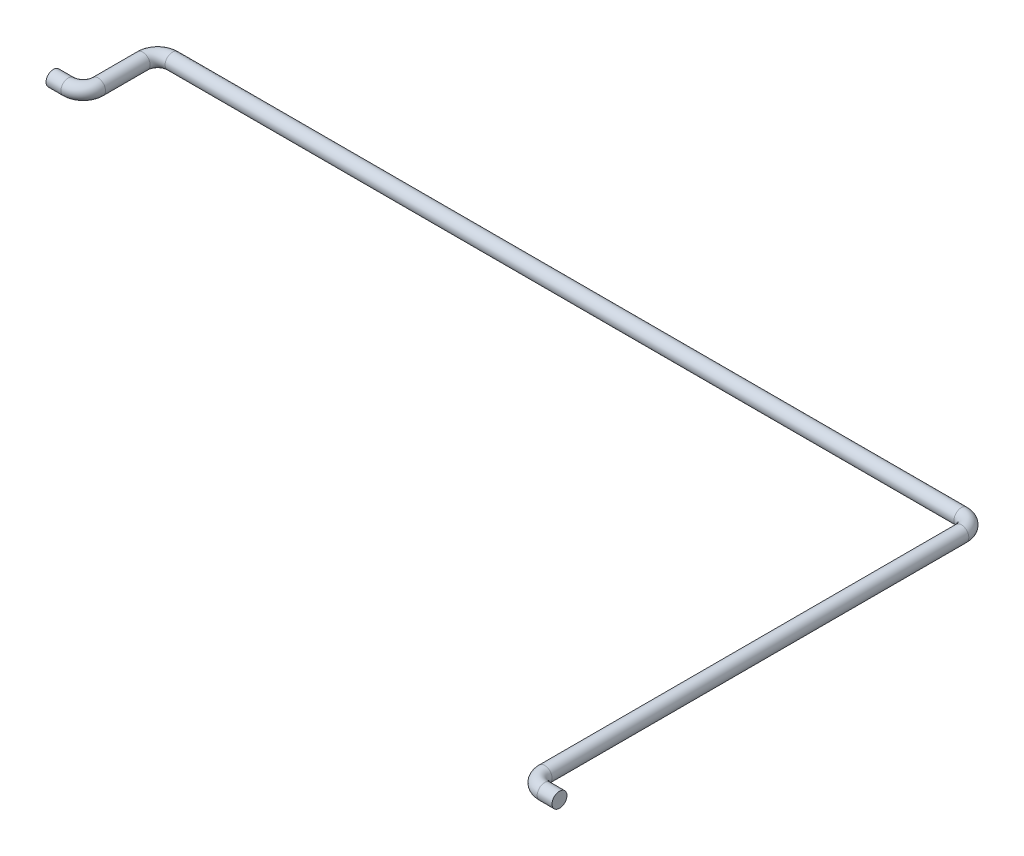
ISO-10303-21;
HEADER;
FILE_DESCRIPTION(('STEP AP214'),'2;1');
FILE_NAME('part.step','',(''),(''),'','','');
FILE_SCHEMA(('AUTOMOTIVE_DESIGN { 1 0 10303 214 1 1 1 1 }'));
ENDSEC;
DATA;
#1=APPLICATION_CONTEXT('core data for automotive mechanical design processes');
#2=APPLICATION_PROTOCOL_DEFINITION('international standard','automotive_design',2000,#1);
#3=PRODUCT_CONTEXT('',#1,'mechanical');
#4=PRODUCT('Part','Part','',(#3));
#5=PRODUCT_RELATED_PRODUCT_CATEGORY('part','',(#4));
#6=PRODUCT_DEFINITION_FORMATION('','',#4);
#7=PRODUCT_DEFINITION_CONTEXT('part definition',#1,'design');
#8=PRODUCT_DEFINITION('design','',#6,#7);
#9=PRODUCT_DEFINITION_SHAPE('','',#8);
#10=(LENGTH_UNIT() NAMED_UNIT(*) SI_UNIT(.MILLI.,.METRE.));
#11=(NAMED_UNIT(*) PLANE_ANGLE_UNIT() SI_UNIT($,.RADIAN.));
#12=(NAMED_UNIT(*) SI_UNIT($,.STERADIAN.) SOLID_ANGLE_UNIT());
#13=UNCERTAINTY_MEASURE_WITH_UNIT(LENGTH_MEASURE(1.E-05),#10,'distance_accuracy_value','');
#14=(GEOMETRIC_REPRESENTATION_CONTEXT(3) GLOBAL_UNCERTAINTY_ASSIGNED_CONTEXT((#13)) GLOBAL_UNIT_ASSIGNED_CONTEXT((#10,
#11,#12)) REPRESENTATION_CONTEXT('',''));
#15=CARTESIAN_POINT('',(0.,0.,0.));
#16=DIRECTION('',(0.,0.,1.));
#17=DIRECTION('',(1.,0.,0.));
#18=AXIS2_PLACEMENT_3D('',#15,#16,#17);
#19=CARTESIAN_POINT('',(58.,0.,25.));
#20=DIRECTION('',(1.,0.,0.));
#21=DIRECTION('',(0.,0.,-1.));
#22=AXIS2_PLACEMENT_3D('',#19,#20,#21);
#23=CYLINDRICAL_SURFACE('',#22,0.5);
#24=CARTESIAN_POINT('',(58.,0.,25.));
#25=DIRECTION('',(1.,0.,0.));
#26=DIRECTION('',(0.,0.,-1.));
#27=AXIS2_PLACEMENT_3D('',#24,#25,#26);
#28=CIRCLE('',#27,0.5);
#29=CARTESIAN_POINT('',(58.,0.,25.5));
#30=VERTEX_POINT('',#29);
#31=EDGE_CURVE('E37',#30,#30,#28,.T.);
#32=ORIENTED_EDGE('',*,*,#31,.T.);
#33=EDGE_LOOP('',(#32));
#34=FACE_BOUND('',#33,.T.);
#35=CARTESIAN_POINT('',(59.,0.,25.));
#36=DIRECTION('',(1.,0.,0.));
#37=DIRECTION('',(0.,0.,-1.));
#38=AXIS2_PLACEMENT_3D('',#35,#36,#37);
#39=CIRCLE('',#38,0.5);
#40=CARTESIAN_POINT('',(59.,0.,24.5));
#41=VERTEX_POINT('',#40);
#42=EDGE_CURVE('E10',#41,#41,#39,.T.);
#43=ORIENTED_EDGE('',*,*,#42,.F.);
#44=EDGE_LOOP('',(#43));
#45=FACE_BOUND('',#44,.T.);
#46=ADVANCED_FACE('F31',(#34,#45),#23,.T.);
#47=CARTESIAN_POINT('',(58.,0.,24.));
#48=DIRECTION('',(0.,1.,0.));
#49=DIRECTION('',(0.,0.,1.));
#50=AXIS2_PLACEMENT_3D('',#47,#48,#49);
#51=TOROIDAL_SURFACE('',#50,1.00000000000001,0.5);
#52=CARTESIAN_POINT('',(57.,0.,24.));
#53=DIRECTION('',(0.,0.,1.));
#54=DIRECTION('',(1.,0.,0.));
#55=AXIS2_PLACEMENT_3D('',#52,#53,#54);
#56=CIRCLE('',#55,0.5);
#57=CARTESIAN_POINT('',(56.5,0.,24.));
#58=VERTEX_POINT('',#57);
#59=EDGE_CURVE('E41',#58,#58,#56,.T.);
#60=CARTESIAN_POINT('',(58.,0.,24.));
#61=DIRECTION('',(0.,1.,0.));
#62=DIRECTION('',(0.,0.,1.));
#63=AXIS2_PLACEMENT_3D('',#60,#61,#62);
#64=CIRCLE('',#63,1.50000000000001);
#65=EDGE_CURVE('',#58,#30,#64,.T.);
#66=ORIENTED_EDGE('',*,*,#59,.T.);
#67=ORIENTED_EDGE('',*,*,#31,.F.);
#68=ORIENTED_EDGE('',*,*,#65,.T.);
#69=ORIENTED_EDGE('',*,*,#65,.F.);
#70=EDGE_LOOP('',(#66,#68,#67,#69));
#71=FACE_BOUND('',#70,.T.);
#72=ADVANCED_FACE('F87',(#71),#51,.T.);
#73=CARTESIAN_POINT('',(57.,0.,-4.));
#74=DIRECTION('',(0.,0.,1.));
#75=DIRECTION('',(1.,0.,0.));
#76=AXIS2_PLACEMENT_3D('',#73,#74,#75);
#77=CYLINDRICAL_SURFACE('',#76,0.5);
#78=CARTESIAN_POINT('',(57.,0.,-4.));
#79=DIRECTION('',(0.,0.,1.));
#80=DIRECTION('',(1.,0.,0.));
#81=AXIS2_PLACEMENT_3D('',#78,#79,#80);
#82=CIRCLE('',#81,0.5);
#83=CARTESIAN_POINT('',(57.5,0.,-3.99999999999999));
#84=VERTEX_POINT('',#83);
#85=EDGE_CURVE('E45',#84,#84,#82,.T.);
#86=ORIENTED_EDGE('',*,*,#85,.T.);
#87=EDGE_LOOP('',(#86));
#88=FACE_BOUND('',#87,.T.);
#89=ORIENTED_EDGE('',*,*,#59,.F.);
#90=EDGE_LOOP('',(#89));
#91=FACE_BOUND('',#90,.T.);
#92=ADVANCED_FACE('F91',(#88,#91),#77,.T.);
#93=CARTESIAN_POINT('',(56.,0.,-4.));
#94=DIRECTION('',(0.,-1.,0.));
#95=DIRECTION('',(0.,0.,-1.));
#96=AXIS2_PLACEMENT_3D('',#93,#94,#95);
#97=TOROIDAL_SURFACE('',#96,1.,0.5);
#98=CARTESIAN_POINT('',(56.,0.,-5.));
#99=DIRECTION('',(1.,0.,0.));
#100=DIRECTION('',(0.,0.,-1.));
#101=AXIS2_PLACEMENT_3D('',#98,#99,#100);
#102=CIRCLE('',#101,0.5);
#103=CARTESIAN_POINT('',(56.,0.,-5.5));
#104=VERTEX_POINT('',#103);
#105=EDGE_CURVE('E50',#104,#104,#102,.T.);
#106=CARTESIAN_POINT('',(56.,0.,-4.));
#107=DIRECTION('',(0.,-1.,0.));
#108=DIRECTION('',(0.,0.,-1.));
#109=AXIS2_PLACEMENT_3D('',#106,#107,#108);
#110=CIRCLE('',#109,1.5);
#111=EDGE_CURVE('',#104,#84,#110,.T.);
#112=ORIENTED_EDGE('',*,*,#105,.T.);
#113=ORIENTED_EDGE('',*,*,#85,.F.);
#114=ORIENTED_EDGE('',*,*,#111,.T.);
#115=ORIENTED_EDGE('',*,*,#111,.F.);
#116=EDGE_LOOP('',(#112,#114,#113,#115));
#117=FACE_BOUND('',#116,.T.);
#118=ADVANCED_FACE('F97',(#117),#97,.T.);
#119=CARTESIAN_POINT('',(3.,0.,-5.));
#120=DIRECTION('',(1.,0.,0.));
#121=DIRECTION('',(0.,0.,-1.));
#122=AXIS2_PLACEMENT_3D('',#119,#120,#121);
#123=CYLINDRICAL_SURFACE('',#122,0.5);
#124=CARTESIAN_POINT('',(3.,0.,-5.));
#125=DIRECTION('',(1.,0.,0.));
#126=DIRECTION('',(0.,0.,-1.));
#127=AXIS2_PLACEMENT_3D('',#124,#125,#126);
#128=CIRCLE('',#127,0.5);
#129=CARTESIAN_POINT('',(3.,0.,-5.5));
#130=VERTEX_POINT('',#129);
#131=EDGE_CURVE('E53',#130,#130,#128,.T.);
#132=ORIENTED_EDGE('',*,*,#131,.T.);
#133=EDGE_LOOP('',(#132));
#134=FACE_BOUND('',#133,.T.);
#135=ORIENTED_EDGE('',*,*,#105,.F.);
#136=EDGE_LOOP('',(#135));
#137=FACE_BOUND('',#136,.T.);
#138=ADVANCED_FACE('F104',(#134,#137),#123,.T.);
#139=CARTESIAN_POINT('',(3.,0.,-4.));
#140=DIRECTION('',(0.,-1.,0.));
#141=DIRECTION('',(0.,0.,-1.));
#142=AXIS2_PLACEMENT_3D('',#139,#140,#141);
#143=TOROIDAL_SURFACE('',#142,1.,0.5);
#144=CARTESIAN_POINT('',(2.,0.,-4.));
#145=DIRECTION('',(0.,0.,-1.));
#146=DIRECTION('',(-1.,0.,0.));
#147=AXIS2_PLACEMENT_3D('',#144,#145,#146);
#148=CIRCLE('',#147,0.5);
#149=CARTESIAN_POINT('',(1.5,0.,-4.));
#150=VERTEX_POINT('',#149);
#151=EDGE_CURVE('E56',#150,#150,#148,.T.);
#152=CARTESIAN_POINT('',(3.,0.,-4.));
#153=DIRECTION('',(0.,-1.,0.));
#154=DIRECTION('',(0.,0.,-1.));
#155=AXIS2_PLACEMENT_3D('',#152,#153,#154);
#156=CIRCLE('',#155,1.5);
#157=EDGE_CURVE('',#150,#130,#156,.T.);
#158=ORIENTED_EDGE('',*,*,#151,.T.);
#159=ORIENTED_EDGE('',*,*,#131,.F.);
#160=ORIENTED_EDGE('',*,*,#157,.T.);
#161=ORIENTED_EDGE('',*,*,#157,.F.);
#162=EDGE_LOOP('',(#158,#160,#159,#161));
#163=FACE_BOUND('',#162,.T.);
#164=ADVANCED_FACE('F108',(#163),#143,.T.);
#165=CARTESIAN_POINT('',(2.,0.,-1.));
#166=DIRECTION('',(0.,0.,-1.));
#167=DIRECTION('',(-1.,0.,0.));
#168=AXIS2_PLACEMENT_3D('',#165,#166,#167);
#169=CYLINDRICAL_SURFACE('',#168,0.5);
#170=CARTESIAN_POINT('',(2.,0.,-1.));
#171=DIRECTION('',(0.,0.,-1.));
#172=DIRECTION('',(-1.,0.,0.));
#173=AXIS2_PLACEMENT_3D('',#170,#171,#172);
#174=CIRCLE('',#173,0.5);
#175=CARTESIAN_POINT('',(2.5,0.,-1.));
#176=VERTEX_POINT('',#175);
#177=EDGE_CURVE('E59',#176,#176,#174,.T.);
#178=ORIENTED_EDGE('',*,*,#177,.T.);
#179=EDGE_LOOP('',(#178));
#180=FACE_BOUND('',#179,.T.);
#181=ORIENTED_EDGE('',*,*,#151,.F.);
#182=EDGE_LOOP('',(#181));
#183=FACE_BOUND('',#182,.T.);
#184=ADVANCED_FACE('F112',(#180,#183),#169,.T.);
#185=CARTESIAN_POINT('',(1.,0.,-1.));
#186=DIRECTION('',(0.,1.,0.));
#187=DIRECTION('',(0.,0.,1.));
#188=AXIS2_PLACEMENT_3D('',#185,#186,#187);
#189=TOROIDAL_SURFACE('',#188,1.,0.5);
#190=CARTESIAN_POINT('',(1.,0.,0.));
#191=DIRECTION('',(1.,0.,0.));
#192=DIRECTION('',(0.,0.,-1.));
#193=AXIS2_PLACEMENT_3D('',#190,#191,#192);
#194=CIRCLE('',#193,0.5);
#195=CARTESIAN_POINT('',(1.,0.,0.5));
#196=VERTEX_POINT('',#195);
#197=EDGE_CURVE('E62',#196,#196,#194,.T.);
#198=CARTESIAN_POINT('',(1.,0.,-1.));
#199=DIRECTION('',(0.,1.,0.));
#200=DIRECTION('',(0.,0.,1.));
#201=AXIS2_PLACEMENT_3D('',#198,#199,#200);
#202=CIRCLE('',#201,1.5);
#203=EDGE_CURVE('',#196,#176,#202,.T.);
#204=ORIENTED_EDGE('',*,*,#197,.T.);
#205=ORIENTED_EDGE('',*,*,#177,.F.);
#206=ORIENTED_EDGE('',*,*,#203,.T.);
#207=ORIENTED_EDGE('',*,*,#203,.F.);
#208=EDGE_LOOP('',(#204,#206,#205,#207));
#209=FACE_BOUND('',#208,.T.);
#210=ADVANCED_FACE('F69',(#209),#189,.T.);
#211=CARTESIAN_POINT('',(1.,0.,0.));
#212=DIRECTION('',(-1.,0.,0.));
#213=DIRECTION('',(0.,0.,1.));
#214=AXIS2_PLACEMENT_3D('',#211,#212,#213);
#215=CYLINDRICAL_SURFACE('',#214,0.5);
#216=ORIENTED_EDGE('',*,*,#197,.F.);
#217=EDGE_LOOP('',(#216));
#218=FACE_BOUND('',#217,.T.);
#219=CARTESIAN_POINT('',(0.,0.,0.));
#220=DIRECTION('',(1.,0.,0.));
#221=DIRECTION('',(0.,0.,-1.));
#222=AXIS2_PLACEMENT_3D('',#219,#220,#221);
#223=CIRCLE('',#222,0.5);
#224=CARTESIAN_POINT('',(0.,0.,-0.5));
#225=VERTEX_POINT('',#224);
#226=EDGE_CURVE('E63',#225,#225,#223,.T.);
#227=ORIENTED_EDGE('',*,*,#226,.T.);
#228=EDGE_LOOP('',(#227));
#229=FACE_BOUND('',#228,.T.);
#230=ADVANCED_FACE('F72',(#218,#229),#215,.T.);
#231=CARTESIAN_POINT('',(59.,0.,25.));
#232=DIRECTION('',(1.,0.,0.));
#233=DIRECTION('',(0.,0.,-1.));
#234=AXIS2_PLACEMENT_3D('',#231,#232,#233);
#235=PLANE('',#234);
#236=ORIENTED_EDGE('',*,*,#42,.T.);
#237=EDGE_LOOP('',(#236));
#238=FACE_BOUND('',#237,.T.);
#239=ADVANCED_FACE('F75',(#238),#235,.T.);
#240=CARTESIAN_POINT('',(0.,0.,0.));
#241=DIRECTION('',(1.,0.,0.));
#242=DIRECTION('',(0.,0.,-1.));
#243=AXIS2_PLACEMENT_3D('',#240,#241,#242);
#244=PLANE('',#243);
#245=ORIENTED_EDGE('',*,*,#226,.F.);
#246=EDGE_LOOP('',(#245));
#247=FACE_BOUND('',#246,.T.);
#248=ADVANCED_FACE('F79',(#247),#244,.F.);
#249=CLOSED_SHELL('',(#46,#72,#92,#118,#138,#164,#184,#210,#230,#239,#248));
#250=MANIFOLD_SOLID_BREP('B2',#249);
#251=ADVANCED_BREP_SHAPE_REPRESENTATION('',(#18,#250),#14);
#252=SHAPE_DEFINITION_REPRESENTATION(#9,#251);
ENDSEC;
END-ISO-10303-21;
